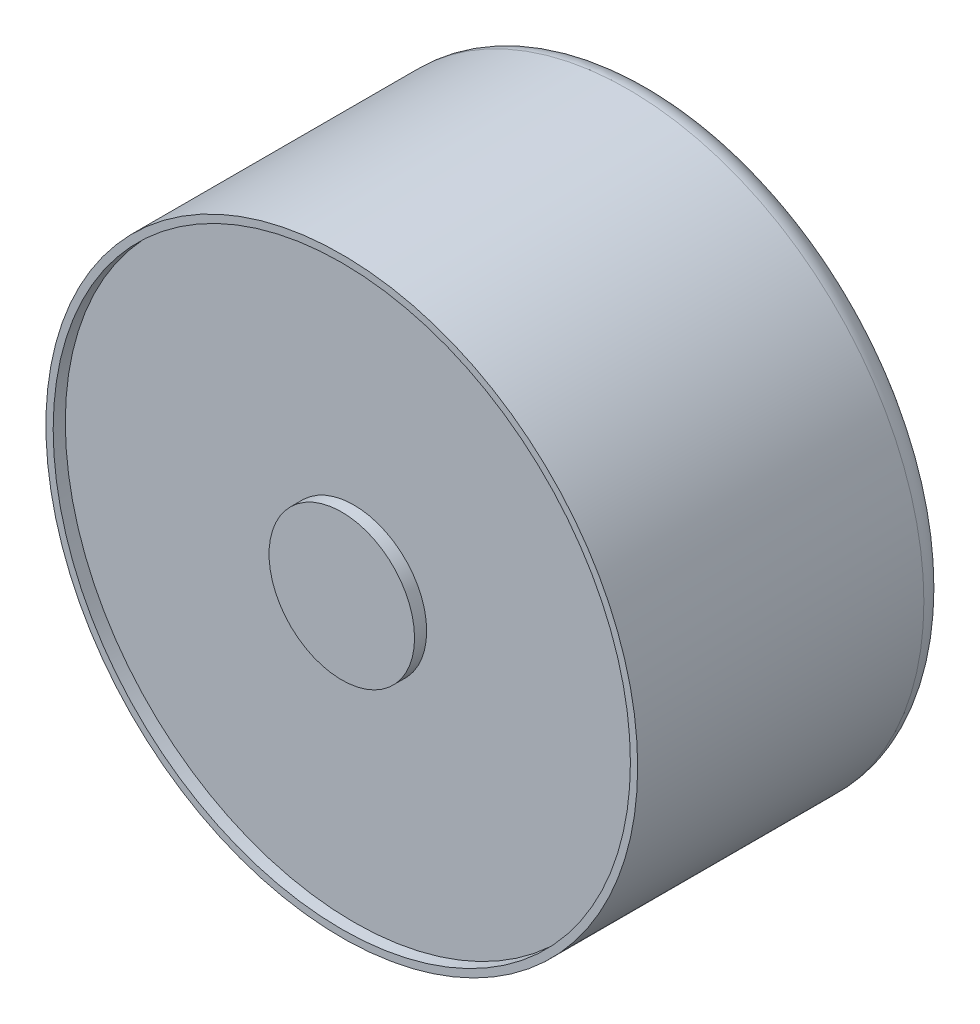
ISO-10303-21;
HEADER;
FILE_DESCRIPTION(('STEP AP214'),'2;1');
FILE_NAME('part.step','',(''),(''),'','','');
FILE_SCHEMA(('AUTOMOTIVE_DESIGN { 1 0 10303 214 1 1 1 1 }'));
ENDSEC;
DATA;
#1=APPLICATION_CONTEXT('core data for automotive mechanical design processes');
#2=APPLICATION_PROTOCOL_DEFINITION('international standard','automotive_design',2000,#1);
#3=PRODUCT_CONTEXT('',#1,'mechanical');
#4=PRODUCT('Part','Part','',(#3));
#5=PRODUCT_RELATED_PRODUCT_CATEGORY('part','',(#4));
#6=PRODUCT_DEFINITION_FORMATION('','',#4);
#7=PRODUCT_DEFINITION_CONTEXT('part definition',#1,'design');
#8=PRODUCT_DEFINITION('design','',#6,#7);
#9=PRODUCT_DEFINITION_SHAPE('','',#8);
#10=(LENGTH_UNIT() NAMED_UNIT(*) SI_UNIT(.MILLI.,.METRE.));
#11=(NAMED_UNIT(*) PLANE_ANGLE_UNIT() SI_UNIT($,.RADIAN.));
#12=(NAMED_UNIT(*) SI_UNIT($,.STERADIAN.) SOLID_ANGLE_UNIT());
#13=UNCERTAINTY_MEASURE_WITH_UNIT(LENGTH_MEASURE(1.E-05),#10,'distance_accuracy_value','');
#14=(GEOMETRIC_REPRESENTATION_CONTEXT(3) GLOBAL_UNCERTAINTY_ASSIGNED_CONTEXT((#13)) GLOBAL_UNIT_ASSIGNED_CONTEXT((#10,
#11,#12)) REPRESENTATION_CONTEXT('',''));
#15=CARTESIAN_POINT('',(0.,0.,0.));
#16=DIRECTION('',(0.,0.,1.));
#17=DIRECTION('',(1.,0.,0.));
#18=AXIS2_PLACEMENT_3D('',#15,#16,#17);
#19=CARTESIAN_POINT('',(0.,0.,0.));
#20=DIRECTION('',(0.,0.,1.));
#21=DIRECTION('',(1.,0.,0.));
#22=AXIS2_PLACEMENT_3D('',#19,#20,#21);
#23=PLANE('',#22);
#24=CARTESIAN_POINT('',(0.,0.,0.));
#25=DIRECTION('',(0.,0.,1.));
#26=DIRECTION('',(1.,0.,0.));
#27=AXIS2_PLACEMENT_3D('',#24,#25,#26);
#28=CIRCLE('',#27,3.);
#29=CARTESIAN_POINT('',(3.,0.,0.));
#30=VERTEX_POINT('',#29);
#31=EDGE_CURVE('E11',#30,#30,#28,.T.);
#32=ORIENTED_EDGE('',*,*,#31,.T.);
#33=EDGE_LOOP('',(#32));
#34=FACE_BOUND('',#33,.T.);
#35=ADVANCED_FACE('F33',(#34),#23,.T.);
#36=CARTESIAN_POINT('',(0.,0.,0.));
#37=DIRECTION('',(0.,0.,1.));
#38=DIRECTION('',(1.,0.,0.));
#39=AXIS2_PLACEMENT_3D('',#36,#37,#38);
#40=CYLINDRICAL_SURFACE('',#39,3.);
#41=CARTESIAN_POINT('',(0.,0.,-0.5));
#42=DIRECTION('',(0.,0.,1.));
#43=DIRECTION('',(1.,0.,0.));
#44=AXIS2_PLACEMENT_3D('',#41,#42,#43);
#45=CIRCLE('',#44,3.);
#46=CARTESIAN_POINT('',(3.,0.,-0.5));
#47=VERTEX_POINT('',#46);
#48=EDGE_CURVE('E40',#47,#47,#45,.T.);
#49=ORIENTED_EDGE('',*,*,#48,.T.);
#50=EDGE_LOOP('',(#49));
#51=FACE_BOUND('',#50,.T.);
#52=ORIENTED_EDGE('',*,*,#31,.F.);
#53=EDGE_LOOP('',(#52));
#54=FACE_BOUND('',#53,.T.);
#55=ADVANCED_FACE('F133',(#51,#54),#40,.T.);
#56=CARTESIAN_POINT('',(3.,0.,-0.5));
#57=DIRECTION('',(0.,0.,1.));
#58=DIRECTION('',(1.,0.,0.));
#59=AXIS2_PLACEMENT_3D('',#56,#57,#58);
#60=PLANE('',#59);
#61=CARTESIAN_POINT('',(0.,0.,-0.5));
#62=DIRECTION('',(0.,0.,1.));
#63=DIRECTION('',(1.,0.,0.));
#64=AXIS2_PLACEMENT_3D('',#61,#62,#63);
#65=CIRCLE('',#64,11.9);
#66=CARTESIAN_POINT('',(11.9,0.,-0.5));
#67=VERTEX_POINT('',#66);
#68=EDGE_CURVE('E128',#67,#67,#65,.T.);
#69=ORIENTED_EDGE('',*,*,#68,.T.);
#70=EDGE_LOOP('',(#69));
#71=FACE_BOUND('',#70,.T.);
#72=ORIENTED_EDGE('',*,*,#48,.F.);
#73=EDGE_LOOP('',(#72));
#74=FACE_BOUND('',#73,.T.);
#75=ADVANCED_FACE('F136',(#71,#74),#60,.T.);
#76=CARTESIAN_POINT('',(0.,0.,0.));
#77=DIRECTION('',(0.,0.,1.));
#78=DIRECTION('',(1.,0.,0.));
#79=AXIS2_PLACEMENT_3D('',#76,#77,#78);
#80=CYLINDRICAL_SURFACE('',#79,11.9);
#81=CARTESIAN_POINT('',(0.,0.,0.));
#82=DIRECTION('',(0.,0.,1.));
#83=DIRECTION('',(1.,0.,0.));
#84=AXIS2_PLACEMENT_3D('',#81,#82,#83);
#85=CIRCLE('',#84,11.9);
#86=CARTESIAN_POINT('',(11.9,0.,0.));
#87=VERTEX_POINT('',#86);
#88=EDGE_CURVE('E125',#87,#87,#85,.T.);
#89=ORIENTED_EDGE('',*,*,#88,.T.);
#90=EDGE_LOOP('',(#89));
#91=FACE_BOUND('',#90,.T.);
#92=ORIENTED_EDGE('',*,*,#68,.F.);
#93=EDGE_LOOP('',(#92));
#94=FACE_BOUND('',#93,.T.);
#95=ADVANCED_FACE('F138',(#91,#94),#80,.F.);
#96=CARTESIAN_POINT('',(11.9,0.,0.));
#97=DIRECTION('',(0.,0.,1.));
#98=DIRECTION('',(1.,0.,0.));
#99=AXIS2_PLACEMENT_3D('',#96,#97,#98);
#100=PLANE('',#99);
#101=CARTESIAN_POINT('',(0.,0.,0.));
#102=DIRECTION('',(0.,0.,1.));
#103=DIRECTION('',(1.,0.,0.));
#104=AXIS2_PLACEMENT_3D('',#101,#102,#103);
#105=CIRCLE('',#104,12.2);
#106=CARTESIAN_POINT('',(12.2,0.,0.));
#107=VERTEX_POINT('',#106);
#108=EDGE_CURVE('E122',#107,#107,#105,.T.);
#109=ORIENTED_EDGE('',*,*,#108,.T.);
#110=EDGE_LOOP('',(#109));
#111=FACE_BOUND('',#110,.T.);
#112=ORIENTED_EDGE('',*,*,#88,.F.);
#113=EDGE_LOOP('',(#112));
#114=FACE_BOUND('',#113,.T.);
#115=ADVANCED_FACE('F145',(#111,#114),#100,.T.);
#116=CARTESIAN_POINT('',(0.,0.,0.));
#117=DIRECTION('',(0.,0.,1.));
#118=DIRECTION('',(1.,0.,0.));
#119=AXIS2_PLACEMENT_3D('',#116,#117,#118);
#120=CYLINDRICAL_SURFACE('',#119,12.2);
#121=CARTESIAN_POINT('',(0.,0.,-11.8));
#122=DIRECTION('',(0.,0.,1.));
#123=DIRECTION('',(1.,0.,0.));
#124=AXIS2_PLACEMENT_3D('',#121,#122,#123);
#125=CIRCLE('',#124,12.2);
#126=CARTESIAN_POINT('',(12.2,0.,-11.8));
#127=VERTEX_POINT('',#126);
#128=EDGE_CURVE('E119',#127,#127,#125,.T.);
#129=ORIENTED_EDGE('',*,*,#128,.T.);
#130=EDGE_LOOP('',(#129));
#131=FACE_BOUND('',#130,.T.);
#132=ORIENTED_EDGE('',*,*,#108,.F.);
#133=EDGE_LOOP('',(#132));
#134=FACE_BOUND('',#133,.T.);
#135=ADVANCED_FACE('F176',(#131,#134),#120,.T.);
#136=CARTESIAN_POINT('',(0.,0.,-11.8));
#137=DIRECTION('',(0.,0.,1.));
#138=DIRECTION('',(1.,0.,0.));
#139=AXIS2_PLACEMENT_3D('',#136,#137,#138);
#140=TOROIDAL_SURFACE('',#139,11.2,0.999999999999999);
#141=CARTESIAN_POINT('',(0.,0.,-12.8));
#142=DIRECTION('',(0.,0.,1.));
#143=DIRECTION('',(1.,0.,0.));
#144=AXIS2_PLACEMENT_3D('',#141,#142,#143);
#145=CIRCLE('',#144,11.2);
#146=CARTESIAN_POINT('',(11.2,0.,-12.8));
#147=VERTEX_POINT('',#146);
#148=EDGE_CURVE('E116',#147,#147,#145,.T.);
#149=ORIENTED_EDGE('',*,*,#148,.T.);
#150=EDGE_LOOP('',(#149));
#151=FACE_BOUND('',#150,.T.);
#152=ORIENTED_EDGE('',*,*,#128,.F.);
#153=EDGE_LOOP('',(#152));
#154=FACE_BOUND('',#153,.T.);
#155=ADVANCED_FACE('F186',(#151,#154),#140,.T.);
#156=CARTESIAN_POINT('',(11.2,0.,-12.8));
#157=DIRECTION('',(0.,0.,-1.));
#158=DIRECTION('',(-1.,0.,0.));
#159=AXIS2_PLACEMENT_3D('',#156,#157,#158);
#160=PLANE('',#159);
#161=CARTESIAN_POINT('',(7.14470958122157,4.12500000000008,-12.8));
#162=DIRECTION('',(0.,0.,-1.));
#163=DIRECTION('',(-1.,0.,0.));
#164=AXIS2_PLACEMENT_3D('',#161,#162,#163);
#165=CIRCLE('',#164,0.99999999999999);
#166=CARTESIAN_POINT('',(6.14470958122158,4.12500000000008,-12.8));
#167=VERTEX_POINT('',#166);
#168=EDGE_CURVE('E70',#167,#167,#165,.T.);
#169=ORIENTED_EDGE('',*,*,#168,.F.);
#170=EDGE_LOOP('',(#169));
#171=FACE_BOUND('',#170,.T.);
#172=CARTESIAN_POINT('',(7.14470958122166,-4.12499999999993,-12.8));
#173=DIRECTION('',(0.,0.,-1.));
#174=DIRECTION('',(-1.,0.,0.));
#175=AXIS2_PLACEMENT_3D('',#172,#173,#174);
#176=CIRCLE('',#175,0.99999999999999);
#177=CARTESIAN_POINT('',(6.14470958122167,-4.12499999999993,-12.8));
#178=VERTEX_POINT('',#177);
#179=EDGE_CURVE('E69',#178,#178,#176,.T.);
#180=ORIENTED_EDGE('',*,*,#179,.F.);
#181=EDGE_LOOP('',(#180));
#182=FACE_BOUND('',#181,.T.);
#183=CARTESIAN_POINT('',(0.,-8.25,-12.8));
#184=DIRECTION('',(0.,0.,-1.));
#185=DIRECTION('',(-1.,0.,0.));
#186=AXIS2_PLACEMENT_3D('',#183,#184,#185);
#187=CIRCLE('',#186,0.999999999999989);
#188=CARTESIAN_POINT('',(-0.999999999999989,-8.25,-12.8));
#189=VERTEX_POINT('',#188);
#190=EDGE_CURVE('E80',#189,#189,#187,.T.);
#191=ORIENTED_EDGE('',*,*,#190,.F.);
#192=EDGE_LOOP('',(#191));
#193=FACE_BOUND('',#192,.T.);
#194=CARTESIAN_POINT('',(-7.1447095812216,-4.12500000000003,-12.8));
#195=DIRECTION('',(0.,0.,-1.));
#196=DIRECTION('',(-1.,0.,0.));
#197=AXIS2_PLACEMENT_3D('',#194,#195,#196);
#198=CIRCLE('',#197,0.999999999999989);
#199=CARTESIAN_POINT('',(-8.14470958122159,-4.12500000000003,-12.8));
#200=VERTEX_POINT('',#199);
#201=EDGE_CURVE('E86',#200,#200,#198,.T.);
#202=ORIENTED_EDGE('',*,*,#201,.F.);
#203=EDGE_LOOP('',(#202));
#204=FACE_BOUND('',#203,.T.);
#205=CARTESIAN_POINT('',(-7.14470958122163,4.12499999999998,-12.8));
#206=DIRECTION('',(0.,0.,-1.));
#207=DIRECTION('',(-1.,0.,0.));
#208=AXIS2_PLACEMENT_3D('',#205,#206,#207);
#209=CIRCLE('',#208,0.999999999999989);
#210=CARTESIAN_POINT('',(-8.14470958122162,4.12499999999998,-12.8));
#211=VERTEX_POINT('',#210);
#212=EDGE_CURVE('E92',#211,#211,#209,.T.);
#213=ORIENTED_EDGE('',*,*,#212,.F.);
#214=EDGE_LOOP('',(#213));
#215=FACE_BOUND('',#214,.T.);
#216=CARTESIAN_POINT('',(0.,8.25,-12.8));
#217=DIRECTION('',(0.,0.,-1.));
#218=DIRECTION('',(-1.,0.,0.));
#219=AXIS2_PLACEMENT_3D('',#216,#217,#218);
#220=CIRCLE('',#219,0.999999999999989);
#221=CARTESIAN_POINT('',(-0.999999999999989,8.25,-12.8));
#222=VERTEX_POINT('',#221);
#223=EDGE_CURVE('E98',#222,#222,#220,.T.);
#224=ORIENTED_EDGE('',*,*,#223,.F.);
#225=EDGE_LOOP('',(#224));
#226=FACE_BOUND('',#225,.T.);
#227=CARTESIAN_POINT('',(0.,0.,-12.8));
#228=DIRECTION('',(0.,0.,1.));
#229=DIRECTION('',(1.,0.,0.));
#230=AXIS2_PLACEMENT_3D('',#227,#228,#229);
#231=CIRCLE('',#230,3.);
#232=CARTESIAN_POINT('',(3.,0.,-12.8));
#233=VERTEX_POINT('',#232);
#234=EDGE_CURVE('E113',#233,#233,#231,.T.);
#235=ORIENTED_EDGE('',*,*,#234,.T.);
#236=EDGE_LOOP('',(#235));
#237=FACE_BOUND('',#236,.T.);
#238=ORIENTED_EDGE('',*,*,#148,.F.);
#239=EDGE_LOOP('',(#238));
#240=FACE_BOUND('',#239,.T.);
#241=ADVANCED_FACE('F196',(#171,#182,#193,#204,#215,#226,#237,#240),#160,.T.);
#242=CARTESIAN_POINT('',(0.,0.,0.));
#243=DIRECTION('',(0.,0.,1.));
#244=DIRECTION('',(1.,0.,0.));
#245=AXIS2_PLACEMENT_3D('',#242,#243,#244);
#246=CYLINDRICAL_SURFACE('',#245,3.);
#247=CARTESIAN_POINT('',(0.,0.,-13.3));
#248=DIRECTION('',(0.,0.,1.));
#249=DIRECTION('',(1.,0.,0.));
#250=AXIS2_PLACEMENT_3D('',#247,#248,#249);
#251=CIRCLE('',#250,3.);
#252=CARTESIAN_POINT('',(3.,0.,-13.3));
#253=VERTEX_POINT('',#252);
#254=EDGE_CURVE('E108',#253,#253,#251,.T.);
#255=ORIENTED_EDGE('',*,*,#254,.T.);
#256=EDGE_LOOP('',(#255));
#257=FACE_BOUND('',#256,.T.);
#258=ORIENTED_EDGE('',*,*,#234,.F.);
#259=EDGE_LOOP('',(#258));
#260=FACE_BOUND('',#259,.T.);
#261=ADVANCED_FACE('F204',(#257,#260),#246,.T.);
#262=CARTESIAN_POINT('',(3.,0.,-13.3));
#263=DIRECTION('',(0.,0.,-1.));
#264=DIRECTION('',(-1.,0.,0.));
#265=AXIS2_PLACEMENT_3D('',#262,#263,#264);
#266=PLANE('',#265);
#267=CARTESIAN_POINT('',(0.,0.,-13.3));
#268=DIRECTION('',(0.,0.,-1.));
#269=DIRECTION('',(-1.,0.,0.));
#270=AXIS2_PLACEMENT_3D('',#267,#268,#269);
#271=CIRCLE('',#270,1.);
#272=CARTESIAN_POINT('',(-1.,0.,-13.3));
#273=VERTEX_POINT('',#272);
#274=EDGE_CURVE('E104',#273,#273,#271,.T.);
#275=ORIENTED_EDGE('',*,*,#274,.F.);
#276=EDGE_LOOP('',(#275));
#277=FACE_BOUND('',#276,.T.);
#278=ORIENTED_EDGE('',*,*,#254,.F.);
#279=EDGE_LOOP('',(#278));
#280=FACE_BOUND('',#279,.T.);
#281=ADVANCED_FACE('F209',(#277,#280),#266,.T.);
#282=CARTESIAN_POINT('',(0.,0.,-19.3));
#283=DIRECTION('',(0.,0.,1.));
#284=DIRECTION('',(1.,0.,0.));
#285=AXIS2_PLACEMENT_3D('',#282,#283,#284);
#286=CYLINDRICAL_SURFACE('',#285,1.);
#287=CARTESIAN_POINT('',(0.,0.,-19.3));
#288=DIRECTION('',(0.,0.,-1.));
#289=DIRECTION('',(-1.,0.,0.));
#290=AXIS2_PLACEMENT_3D('',#287,#288,#289);
#291=CIRCLE('',#290,1.);
#292=CARTESIAN_POINT('',(-1.,0.,-19.3));
#293=VERTEX_POINT('',#292);
#294=EDGE_CURVE('E105',#293,#293,#291,.T.);
#295=ORIENTED_EDGE('',*,*,#294,.F.);
#296=EDGE_LOOP('',(#295));
#297=FACE_BOUND('',#296,.T.);
#298=ORIENTED_EDGE('',*,*,#274,.T.);
#299=EDGE_LOOP('',(#298));
#300=FACE_BOUND('',#299,.T.);
#301=ADVANCED_FACE('F219',(#297,#300),#286,.T.);
#302=CARTESIAN_POINT('',(0.,0.,-19.3));
#303=DIRECTION('',(0.,0.,-1.));
#304=DIRECTION('',(-1.,0.,0.));
#305=AXIS2_PLACEMENT_3D('',#302,#303,#304);
#306=PLANE('',#305);
#307=ORIENTED_EDGE('',*,*,#294,.T.);
#308=EDGE_LOOP('',(#307));
#309=FACE_BOUND('',#308,.T.);
#310=ADVANCED_FACE('F229',(#309),#306,.T.);
#311=CARTESIAN_POINT('',(0.,8.25,-9.8));
#312=DIRECTION('',(0.,0.,-1.));
#313=DIRECTION('',(-1.,0.,0.));
#314=AXIS2_PLACEMENT_3D('',#311,#312,#313);
#315=CONICAL_SURFACE('',#314,0.999999999999999,1.02974425867665);
#316=CARTESIAN_POINT('',(0.,8.25,-9.19913938097244));
#317=VERTEX_POINT('',#316);
#318=VERTEX_LOOP('',#317);
#319=FACE_BOUND('',#318,.T.);
#320=CARTESIAN_POINT('',(0.,8.25,-9.8));
#321=DIRECTION('',(0.,0.,-1.));
#322=DIRECTION('',(-1.,0.,0.));
#323=AXIS2_PLACEMENT_3D('',#320,#321,#322);
#324=CIRCLE('',#323,0.999999999999999);
#325=CARTESIAN_POINT('',(-0.999999999999999,8.25,-9.8));
#326=VERTEX_POINT('',#325);
#327=EDGE_CURVE('E101',#326,#326,#324,.T.);
#328=ORIENTED_EDGE('',*,*,#327,.T.);
#329=EDGE_LOOP('',(#328));
#330=FACE_BOUND('',#329,.T.);
#331=ADVANCED_FACE('F239',(#319,#330),#315,.F.);
#332=CARTESIAN_POINT('',(0.,8.25,-12.8));
#333=DIRECTION('',(0.,0.,-1.));
#334=DIRECTION('',(-1.,0.,0.));
#335=AXIS2_PLACEMENT_3D('',#332,#333,#334);
#336=CYLINDRICAL_SURFACE('',#335,0.999999999999994);
#337=ORIENTED_EDGE('',*,*,#327,.F.);
#338=EDGE_LOOP('',(#337));
#339=FACE_BOUND('',#338,.T.);
#340=ORIENTED_EDGE('',*,*,#223,.T.);
#341=EDGE_LOOP('',(#340));
#342=FACE_BOUND('',#341,.T.);
#343=ADVANCED_FACE('F249',(#339,#342),#336,.F.);
#344=CARTESIAN_POINT('',(-7.14470958122163,4.12499999999998,-9.8));
#345=DIRECTION('',(0.,0.,-1.));
#346=DIRECTION('',(-1.,0.,0.));
#347=AXIS2_PLACEMENT_3D('',#344,#345,#346);
#348=CONICAL_SURFACE('',#347,0.999999999999999,1.02974425867665);
#349=CARTESIAN_POINT('',(-7.14470958122163,4.12499999999998,-9.19913938097244));
#350=VERTEX_POINT('',#349);
#351=VERTEX_LOOP('',#350);
#352=FACE_BOUND('',#351,.T.);
#353=CARTESIAN_POINT('',(-7.14470958122163,4.12499999999998,-9.8));
#354=DIRECTION('',(0.,0.,-1.));
#355=DIRECTION('',(-1.,0.,0.));
#356=AXIS2_PLACEMENT_3D('',#353,#354,#355);
#357=CIRCLE('',#356,0.999999999999999);
#358=CARTESIAN_POINT('',(-8.14470958122163,4.12499999999998,-9.8));
#359=VERTEX_POINT('',#358);
#360=EDGE_CURVE('E95',#359,#359,#357,.T.);
#361=ORIENTED_EDGE('',*,*,#360,.T.);
#362=EDGE_LOOP('',(#361));
#363=FACE_BOUND('',#362,.T.);
#364=ADVANCED_FACE('F258',(#352,#363),#348,.F.);
#365=CARTESIAN_POINT('',(-7.14470958122163,4.12499999999998,-12.8));
#366=DIRECTION('',(0.,0.,-1.));
#367=DIRECTION('',(-1.,0.,0.));
#368=AXIS2_PLACEMENT_3D('',#365,#366,#367);
#369=CYLINDRICAL_SURFACE('',#368,0.999999999999994);
#370=ORIENTED_EDGE('',*,*,#360,.F.);
#371=EDGE_LOOP('',(#370));
#372=FACE_BOUND('',#371,.T.);
#373=ORIENTED_EDGE('',*,*,#212,.T.);
#374=EDGE_LOOP('',(#373));
#375=FACE_BOUND('',#374,.T.);
#376=ADVANCED_FACE('F275',(#372,#375),#369,.F.);
#377=CARTESIAN_POINT('',(-7.1447095812216,-4.12500000000003,-9.8));
#378=DIRECTION('',(0.,0.,-1.));
#379=DIRECTION('',(-1.,0.,0.));
#380=AXIS2_PLACEMENT_3D('',#377,#378,#379);
#381=CONICAL_SURFACE('',#380,0.999999999999999,1.02974425867665);
#382=CARTESIAN_POINT('',(-7.1447095812216,-4.12500000000003,-9.19913938097244));
#383=VERTEX_POINT('',#382);
#384=VERTEX_LOOP('',#383);
#385=FACE_BOUND('',#384,.T.);
#386=CARTESIAN_POINT('',(-7.1447095812216,-4.12500000000003,-9.8));
#387=DIRECTION('',(0.,0.,-1.));
#388=DIRECTION('',(-1.,0.,0.));
#389=AXIS2_PLACEMENT_3D('',#386,#387,#388);
#390=CIRCLE('',#389,0.999999999999999);
#391=CARTESIAN_POINT('',(-8.1447095812216,-4.12500000000003,-9.8));
#392=VERTEX_POINT('',#391);
#393=EDGE_CURVE('E89',#392,#392,#390,.T.);
#394=ORIENTED_EDGE('',*,*,#393,.T.);
#395=EDGE_LOOP('',(#394));
#396=FACE_BOUND('',#395,.T.);
#397=ADVANCED_FACE('F284',(#385,#396),#381,.F.);
#398=CARTESIAN_POINT('',(-7.1447095812216,-4.12500000000003,-12.8));
#399=DIRECTION('',(0.,0.,-1.));
#400=DIRECTION('',(-1.,0.,0.));
#401=AXIS2_PLACEMENT_3D('',#398,#399,#400);
#402=CYLINDRICAL_SURFACE('',#401,0.999999999999994);
#403=ORIENTED_EDGE('',*,*,#393,.F.);
#404=EDGE_LOOP('',(#403));
#405=FACE_BOUND('',#404,.T.);
#406=ORIENTED_EDGE('',*,*,#201,.T.);
#407=EDGE_LOOP('',(#406));
#408=FACE_BOUND('',#407,.T.);
#409=ADVANCED_FACE('F294',(#405,#408),#402,.F.);
#410=CARTESIAN_POINT('',(0.,-8.25,-9.8));
#411=DIRECTION('',(0.,0.,-1.));
#412=DIRECTION('',(-1.,0.,0.));
#413=AXIS2_PLACEMENT_3D('',#410,#411,#412);
#414=CONICAL_SURFACE('',#413,0.999999999999999,1.02974425867665);
#415=CARTESIAN_POINT('',(0.,-8.25,-9.19913938097244));
#416=VERTEX_POINT('',#415);
#417=VERTEX_LOOP('',#416);
#418=FACE_BOUND('',#417,.T.);
#419=CARTESIAN_POINT('',(0.,-8.25,-9.8));
#420=DIRECTION('',(0.,0.,-1.));
#421=DIRECTION('',(-1.,0.,0.));
#422=AXIS2_PLACEMENT_3D('',#419,#420,#421);
#423=CIRCLE('',#422,0.999999999999999);
#424=CARTESIAN_POINT('',(-0.999999999999999,-8.25,-9.8));
#425=VERTEX_POINT('',#424);
#426=EDGE_CURVE('E83',#425,#425,#423,.T.);
#427=ORIENTED_EDGE('',*,*,#426,.T.);
#428=EDGE_LOOP('',(#427));
#429=FACE_BOUND('',#428,.T.);
#430=ADVANCED_FACE('F304',(#418,#429),#414,.F.);
#431=CARTESIAN_POINT('',(0.,-8.25,-12.8));
#432=DIRECTION('',(0.,0.,-1.));
#433=DIRECTION('',(-1.,0.,0.));
#434=AXIS2_PLACEMENT_3D('',#431,#432,#433);
#435=CYLINDRICAL_SURFACE('',#434,0.999999999999994);
#436=ORIENTED_EDGE('',*,*,#426,.F.);
#437=EDGE_LOOP('',(#436));
#438=FACE_BOUND('',#437,.T.);
#439=ORIENTED_EDGE('',*,*,#190,.T.);
#440=EDGE_LOOP('',(#439));
#441=FACE_BOUND('',#440,.T.);
#442=ADVANCED_FACE('F314',(#438,#441),#435,.F.);
#443=CARTESIAN_POINT('',(7.14470958122166,-4.12499999999993,-9.8));
#444=DIRECTION('',(0.,0.,-1.));
#445=DIRECTION('',(-1.,0.,0.));
#446=AXIS2_PLACEMENT_3D('',#443,#444,#445);
#447=CONICAL_SURFACE('',#446,0.999999999999998,1.02974425867665);
#448=CARTESIAN_POINT('',(7.14470958122166,-4.12499999999993,-9.19913938097244));
#449=VERTEX_POINT('',#448);
#450=VERTEX_LOOP('',#449);
#451=FACE_BOUND('',#450,.T.);
#452=CARTESIAN_POINT('',(7.14470958122166,-4.12499999999993,-9.8));
#453=DIRECTION('',(0.,0.,-1.));
#454=DIRECTION('',(-1.,0.,0.));
#455=AXIS2_PLACEMENT_3D('',#452,#453,#454);
#456=CIRCLE('',#455,0.999999999999998);
#457=CARTESIAN_POINT('',(6.14470958122166,-4.12499999999993,-9.8));
#458=VERTEX_POINT('',#457);
#459=EDGE_CURVE('E73',#458,#458,#456,.T.);
#460=ORIENTED_EDGE('',*,*,#459,.T.);
#461=EDGE_LOOP('',(#460));
#462=FACE_BOUND('',#461,.T.);
#463=ADVANCED_FACE('F324',(#451,#462),#447,.F.);
#464=CARTESIAN_POINT('',(7.14470958122166,-4.12499999999993,-12.8));
#465=DIRECTION('',(0.,0.,-1.));
#466=DIRECTION('',(-1.,0.,0.));
#467=AXIS2_PLACEMENT_3D('',#464,#465,#466);
#468=CYLINDRICAL_SURFACE('',#467,0.999999999999994);
#469=ORIENTED_EDGE('',*,*,#459,.F.);
#470=EDGE_LOOP('',(#469));
#471=FACE_BOUND('',#470,.T.);
#472=ORIENTED_EDGE('',*,*,#179,.T.);
#473=EDGE_LOOP('',(#472));
#474=FACE_BOUND('',#473,.T.);
#475=ADVANCED_FACE('F63',(#471,#474),#468,.F.);
#476=CARTESIAN_POINT('',(7.14470958122157,4.12500000000008,-9.8));
#477=DIRECTION('',(0.,0.,-1.));
#478=DIRECTION('',(-1.,0.,0.));
#479=AXIS2_PLACEMENT_3D('',#476,#477,#478);
#480=CONICAL_SURFACE('',#479,0.999999999999998,1.02974425867665);
#481=CARTESIAN_POINT('',(7.14470958122157,4.12500000000008,-9.19913938097244));
#482=VERTEX_POINT('',#481);
#483=VERTEX_LOOP('',#482);
#484=FACE_BOUND('',#483,.T.);
#485=CARTESIAN_POINT('',(7.14470958122157,4.12500000000008,-9.8));
#486=DIRECTION('',(0.,0.,-1.));
#487=DIRECTION('',(-1.,0.,0.));
#488=AXIS2_PLACEMENT_3D('',#485,#486,#487);
#489=CIRCLE('',#488,0.999999999999998);
#490=CARTESIAN_POINT('',(6.14470958122157,4.12500000000008,-9.8));
#491=VERTEX_POINT('',#490);
#492=EDGE_CURVE('E67',#491,#491,#489,.T.);
#493=ORIENTED_EDGE('',*,*,#492,.T.);
#494=EDGE_LOOP('',(#493));
#495=FACE_BOUND('',#494,.T.);
#496=ADVANCED_FACE('F59',(#484,#495),#480,.F.);
#497=CARTESIAN_POINT('',(7.14470958122157,4.12500000000008,-12.8));
#498=DIRECTION('',(0.,0.,-1.));
#499=DIRECTION('',(-1.,0.,0.));
#500=AXIS2_PLACEMENT_3D('',#497,#498,#499);
#501=CYLINDRICAL_SURFACE('',#500,0.999999999999994);
#502=ORIENTED_EDGE('',*,*,#492,.F.);
#503=EDGE_LOOP('',(#502));
#504=FACE_BOUND('',#503,.T.);
#505=ORIENTED_EDGE('',*,*,#168,.T.);
#506=EDGE_LOOP('',(#505));
#507=FACE_BOUND('',#506,.T.);
#508=ADVANCED_FACE('F62',(#504,#507),#501,.F.);
#509=CLOSED_SHELL('',(#35,#55,#75,#95,#115,#135,#155,#241,#261,#281,#301,#310,#331,#343,#364,
#376,#397,#409,#430,#442,#463,#475,#496,#508));
#510=MANIFOLD_SOLID_BREP('B2',#509);
#511=ADVANCED_BREP_SHAPE_REPRESENTATION('',(#18,#510),#14);
#512=SHAPE_DEFINITION_REPRESENTATION(#9,#511);
ENDSEC;
END-ISO-10303-21;
